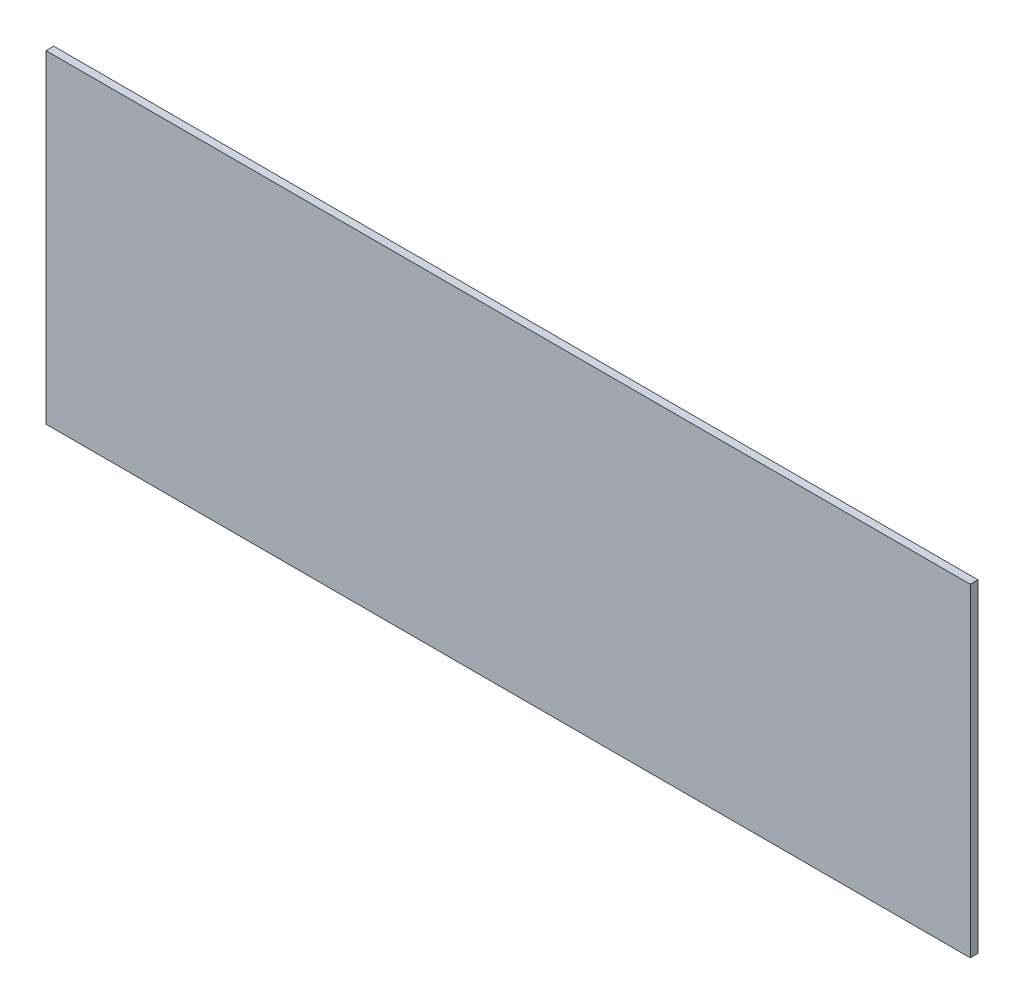
ISO-10303-21;
HEADER;
FILE_DESCRIPTION(('STEP AP214'),'2;1');
FILE_NAME('part.step','',(''),(''),'','','');
FILE_SCHEMA(('AUTOMOTIVE_DESIGN { 1 0 10303 214 1 1 1 1 }'));
ENDSEC;
DATA;
#1=APPLICATION_CONTEXT('core data for automotive mechanical design processes');
#2=APPLICATION_PROTOCOL_DEFINITION('international standard','automotive_design',2000,#1);
#3=PRODUCT_CONTEXT('',#1,'mechanical');
#4=PRODUCT('Part','Part','',(#3));
#5=PRODUCT_RELATED_PRODUCT_CATEGORY('part','',(#4));
#6=PRODUCT_DEFINITION_FORMATION('','',#4);
#7=PRODUCT_DEFINITION_CONTEXT('part definition',#1,'design');
#8=PRODUCT_DEFINITION('design','',#6,#7);
#9=PRODUCT_DEFINITION_SHAPE('','',#8);
#10=(LENGTH_UNIT() NAMED_UNIT(*) SI_UNIT(.MILLI.,.METRE.));
#11=(NAMED_UNIT(*) PLANE_ANGLE_UNIT() SI_UNIT($,.RADIAN.));
#12=(NAMED_UNIT(*) SI_UNIT($,.STERADIAN.) SOLID_ANGLE_UNIT());
#13=UNCERTAINTY_MEASURE_WITH_UNIT(LENGTH_MEASURE(1.E-05),#10,'distance_accuracy_value','');
#14=(GEOMETRIC_REPRESENTATION_CONTEXT(3) GLOBAL_UNCERTAINTY_ASSIGNED_CONTEXT((#13)) GLOBAL_UNIT_ASSIGNED_CONTEXT((#10,
#11,#12)) REPRESENTATION_CONTEXT('',''));
#15=CARTESIAN_POINT('',(0.,0.,0.));
#16=DIRECTION('',(0.,0.,1.));
#17=DIRECTION('',(1.,0.,0.));
#18=AXIS2_PLACEMENT_3D('',#15,#16,#17);
#19=CARTESIAN_POINT('',(190.5,-66.675,3.175));
#20=DIRECTION('',(-1.,0.,0.));
#21=DIRECTION('',(0.,0.,1.));
#22=AXIS2_PLACEMENT_3D('',#19,#20,#21);
#23=PLANE('',#22);
#24=DIRECTION('',(0.,1.,0.));
#25=VECTOR('',#24,1.);
#26=CARTESIAN_POINT('',(190.5,-66.675,0.));
#27=LINE('',#26,#25);
#28=CARTESIAN_POINT('',(190.5,-66.675,0.));
#29=VERTEX_POINT('',#28);
#30=CARTESIAN_POINT('',(190.5,66.675,0.));
#31=VERTEX_POINT('',#30);
#32=EDGE_CURVE('E97',#29,#31,#27,.T.);
#33=ORIENTED_EDGE('',*,*,#32,.T.);
#34=DIRECTION('',(0.,0.,-1.));
#35=VECTOR('',#34,1.);
#36=CARTESIAN_POINT('',(190.5,66.675,3.175));
#37=LINE('',#36,#35);
#38=CARTESIAN_POINT('',(190.5,66.675,3.175));
#39=VERTEX_POINT('',#38);
#40=EDGE_CURVE('E11',#39,#31,#37,.T.);
#41=ORIENTED_EDGE('',*,*,#40,.F.);
#42=DIRECTION('',(0.,1.,0.));
#43=VECTOR('',#42,1.);
#44=CARTESIAN_POINT('',(190.5,-66.675,3.175));
#45=LINE('',#44,#43);
#46=CARTESIAN_POINT('',(190.5,-66.675,3.175));
#47=VERTEX_POINT('',#46);
#48=EDGE_CURVE('E85',#47,#39,#45,.T.);
#49=ORIENTED_EDGE('',*,*,#48,.F.);
#50=DIRECTION('',(0.,0.,-1.));
#51=VECTOR('',#50,1.);
#52=CARTESIAN_POINT('',(190.5,-66.675,3.175));
#53=LINE('',#52,#51);
#54=EDGE_CURVE('E93',#47,#29,#53,.T.);
#55=ORIENTED_EDGE('',*,*,#54,.T.);
#56=EDGE_LOOP('',(#33,#41,#49,#55));
#57=FACE_BOUND('',#56,.T.);
#58=ADVANCED_FACE('F34',(#57),#23,.F.);
#59=CARTESIAN_POINT('',(-190.5,66.675,3.175));
#60=DIRECTION('',(0.,-1.,0.));
#61=DIRECTION('',(0.,0.,-1.));
#62=AXIS2_PLACEMENT_3D('',#59,#60,#61);
#63=PLANE('',#62);
#64=DIRECTION('',(-1.,0.,0.));
#65=VECTOR('',#64,1.);
#66=CARTESIAN_POINT('',(-190.5,66.675,0.));
#67=LINE('',#66,#65);
#68=CARTESIAN_POINT('',(-190.5,66.675,0.));
#69=VERTEX_POINT('',#68);
#70=EDGE_CURVE('E89',#31,#69,#67,.T.);
#71=ORIENTED_EDGE('',*,*,#70,.T.);
#72=DIRECTION('',(0.,0.,-1.));
#73=VECTOR('',#72,1.);
#74=CARTESIAN_POINT('',(-190.5,66.675,3.175));
#75=LINE('',#74,#73);
#76=CARTESIAN_POINT('',(-190.5,66.675,3.175));
#77=VERTEX_POINT('',#76);
#78=EDGE_CURVE('E42',#77,#69,#75,.T.);
#79=ORIENTED_EDGE('',*,*,#78,.F.);
#80=DIRECTION('',(-1.,0.,0.));
#81=VECTOR('',#80,1.);
#82=CARTESIAN_POINT('',(-190.5,66.675,3.175));
#83=LINE('',#82,#81);
#84=EDGE_CURVE('E80',#39,#77,#83,.T.);
#85=ORIENTED_EDGE('',*,*,#84,.F.);
#86=ORIENTED_EDGE('',*,*,#40,.T.);
#87=EDGE_LOOP('',(#71,#79,#85,#86));
#88=FACE_BOUND('',#87,.T.);
#89=ADVANCED_FACE('F88',(#88),#63,.F.);
#90=CARTESIAN_POINT('',(-190.5,-66.675,3.175));
#91=DIRECTION('',(1.,0.,0.));
#92=DIRECTION('',(0.,0.,-1.));
#93=AXIS2_PLACEMENT_3D('',#90,#91,#92);
#94=PLANE('',#93);
#95=DIRECTION('',(0.,-1.,0.));
#96=VECTOR('',#95,1.);
#97=CARTESIAN_POINT('',(-190.5,-66.675,0.));
#98=LINE('',#97,#96);
#99=CARTESIAN_POINT('',(-190.5,-66.675,0.));
#100=VERTEX_POINT('',#99);
#101=EDGE_CURVE('E67',#69,#100,#98,.T.);
#102=ORIENTED_EDGE('',*,*,#101,.T.);
#103=DIRECTION('',(0.,0.,-1.));
#104=VECTOR('',#103,1.);
#105=CARTESIAN_POINT('',(-190.5,-66.675,3.175));
#106=LINE('',#105,#104);
#107=CARTESIAN_POINT('',(-190.5,-66.675,3.175));
#108=VERTEX_POINT('',#107);
#109=EDGE_CURVE('E90',#108,#100,#106,.T.);
#110=ORIENTED_EDGE('',*,*,#109,.F.);
#111=DIRECTION('',(0.,-1.,0.));
#112=VECTOR('',#111,1.);
#113=CARTESIAN_POINT('',(-190.5,-66.675,3.175));
#114=LINE('',#113,#112);
#115=EDGE_CURVE('E83',#77,#108,#114,.T.);
#116=ORIENTED_EDGE('',*,*,#115,.F.);
#117=ORIENTED_EDGE('',*,*,#78,.T.);
#118=EDGE_LOOP('',(#102,#110,#116,#117));
#119=FACE_BOUND('',#118,.T.);
#120=ADVANCED_FACE('F91',(#119),#94,.F.);
#121=CARTESIAN_POINT('',(-190.5,-66.675,3.175));
#122=DIRECTION('',(0.,1.,0.));
#123=DIRECTION('',(0.,0.,1.));
#124=AXIS2_PLACEMENT_3D('',#121,#122,#123);
#125=PLANE('',#124);
#126=DIRECTION('',(1.,0.,0.));
#127=VECTOR('',#126,1.);
#128=CARTESIAN_POINT('',(-190.5,-66.675,0.));
#129=LINE('',#128,#127);
#130=EDGE_CURVE('E73',#100,#29,#129,.T.);
#131=ORIENTED_EDGE('',*,*,#130,.T.);
#132=ORIENTED_EDGE('',*,*,#54,.F.);
#133=DIRECTION('',(1.,0.,0.));
#134=VECTOR('',#133,1.);
#135=CARTESIAN_POINT('',(-190.5,-66.675,3.175));
#136=LINE('',#135,#134);
#137=EDGE_CURVE('E50',#108,#47,#136,.T.);
#138=ORIENTED_EDGE('',*,*,#137,.F.);
#139=ORIENTED_EDGE('',*,*,#109,.T.);
#140=EDGE_LOOP('',(#131,#132,#138,#139));
#141=FACE_BOUND('',#140,.T.);
#142=ADVANCED_FACE('F104',(#141),#125,.F.);
#143=CARTESIAN_POINT('',(0.,0.,3.175));
#144=DIRECTION('',(0.,0.,-1.));
#145=DIRECTION('',(-1.,0.,0.));
#146=AXIS2_PLACEMENT_3D('',#143,#144,#145);
#147=PLANE('',#146);
#148=ORIENTED_EDGE('',*,*,#48,.T.);
#149=ORIENTED_EDGE('',*,*,#84,.T.);
#150=ORIENTED_EDGE('',*,*,#115,.T.);
#151=ORIENTED_EDGE('',*,*,#137,.T.);
#152=EDGE_LOOP('',(#148,#149,#150,#151));
#153=FACE_BOUND('',#152,.T.);
#154=ADVANCED_FACE('F81',(#153),#147,.F.);
#155=CARTESIAN_POINT('',(0.,0.,0.));
#156=DIRECTION('',(0.,0.,-1.));
#157=DIRECTION('',(-1.,0.,0.));
#158=AXIS2_PLACEMENT_3D('',#155,#156,#157);
#159=PLANE('',#158);
#160=ORIENTED_EDGE('',*,*,#32,.F.);
#161=ORIENTED_EDGE('',*,*,#130,.F.);
#162=ORIENTED_EDGE('',*,*,#101,.F.);
#163=ORIENTED_EDGE('',*,*,#70,.F.);
#164=EDGE_LOOP('',(#160,#161,#162,#163));
#165=FACE_BOUND('',#164,.T.);
#166=ADVANCED_FACE('F107',(#165),#159,.T.);
#167=CLOSED_SHELL('',(#58,#89,#120,#142,#154,#166));
#168=MANIFOLD_SOLID_BREP('B2',#167);
#169=ADVANCED_BREP_SHAPE_REPRESENTATION('',(#18,#168),#14);
#170=SHAPE_DEFINITION_REPRESENTATION(#9,#169);
ENDSEC;
END-ISO-10303-21;
